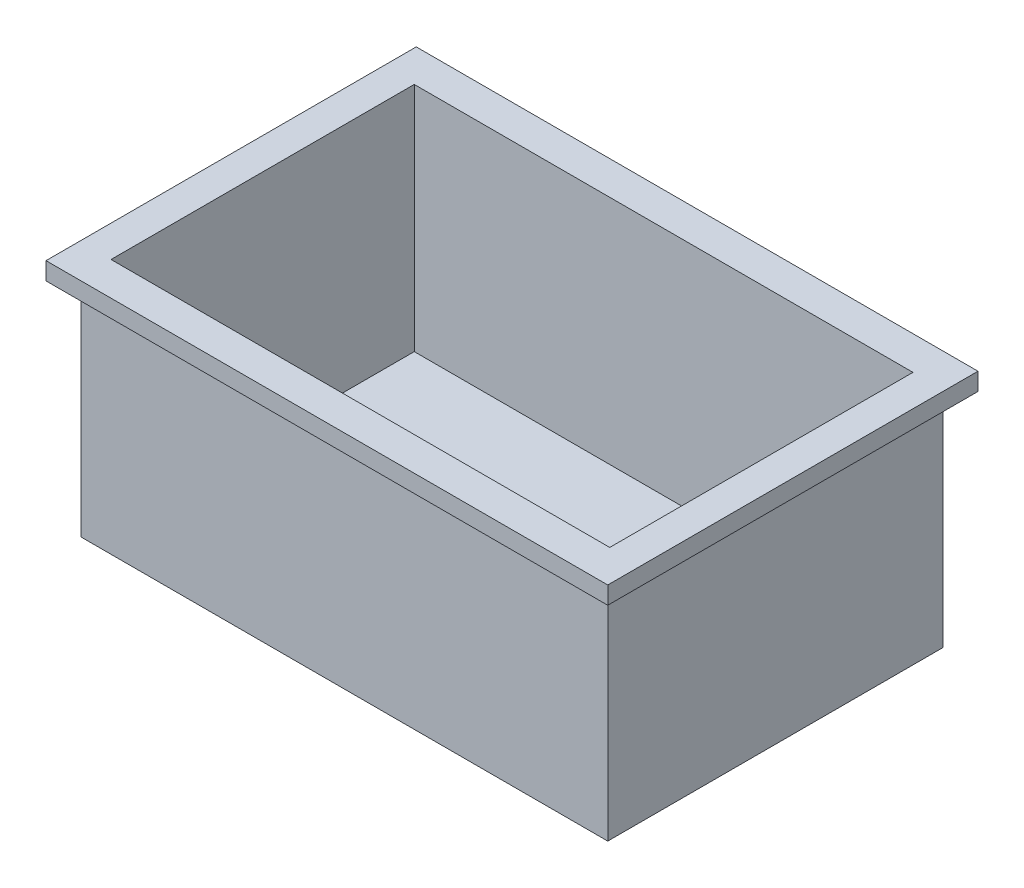
ISO-10303-21;
HEADER;
FILE_DESCRIPTION(('STEP AP214'),'2;1');
FILE_NAME('part.step','',(''),(''),'','','');
FILE_SCHEMA(('AUTOMOTIVE_DESIGN { 1 0 10303 214 1 1 1 1 }'));
ENDSEC;
DATA;
#1=APPLICATION_CONTEXT('core data for automotive mechanical design processes');
#2=APPLICATION_PROTOCOL_DEFINITION('international standard','automotive_design',2000,#1);
#3=PRODUCT_CONTEXT('',#1,'mechanical');
#4=PRODUCT('Part','Part','',(#3));
#5=PRODUCT_RELATED_PRODUCT_CATEGORY('part','',(#4));
#6=PRODUCT_DEFINITION_FORMATION('','',#4);
#7=PRODUCT_DEFINITION_CONTEXT('part definition',#1,'design');
#8=PRODUCT_DEFINITION('design','',#6,#7);
#9=PRODUCT_DEFINITION_SHAPE('','',#8);
#10=(LENGTH_UNIT() NAMED_UNIT(*) SI_UNIT(.MILLI.,.METRE.));
#11=(NAMED_UNIT(*) PLANE_ANGLE_UNIT() SI_UNIT($,.RADIAN.));
#12=(NAMED_UNIT(*) SI_UNIT($,.STERADIAN.) SOLID_ANGLE_UNIT());
#13=UNCERTAINTY_MEASURE_WITH_UNIT(LENGTH_MEASURE(1.E-05),#10,'distance_accuracy_value','');
#14=(GEOMETRIC_REPRESENTATION_CONTEXT(3) GLOBAL_UNCERTAINTY_ASSIGNED_CONTEXT((#13)) GLOBAL_UNIT_ASSIGNED_CONTEXT((#10,
#11,#12)) REPRESENTATION_CONTEXT('',''));
#15=CARTESIAN_POINT('',(0.,0.,0.));
#16=DIRECTION('',(0.,0.,1.));
#17=DIRECTION('',(1.,0.,0.));
#18=AXIS2_PLACEMENT_3D('',#15,#16,#17);
#19=CARTESIAN_POINT('',(312.5,10.,190.));
#20=DIRECTION('',(1.,0.,0.));
#21=DIRECTION('',(0.,0.,-1.));
#22=AXIS2_PLACEMENT_3D('',#19,#20,#21);
#23=PLANE('',#22);
#24=DIRECTION('',(0.,0.,1.));
#25=VECTOR('',#24,1.);
#26=CARTESIAN_POINT('',(312.5,0.,190.));
#27=LINE('',#26,#25);
#28=CARTESIAN_POINT('',(312.5,0.,-190.));
#29=VERTEX_POINT('',#28);
#30=CARTESIAN_POINT('',(312.5,0.,190.));
#31=VERTEX_POINT('',#30);
#32=EDGE_CURVE('E106',#29,#31,#27,.T.);
#33=ORIENTED_EDGE('',*,*,#32,.F.);
#34=DIRECTION('',(0.,-1.,0.));
#35=VECTOR('',#34,1.);
#36=CARTESIAN_POINT('',(312.5,10.,-190.));
#37=LINE('',#36,#35);
#38=CARTESIAN_POINT('',(312.5,10.,-190.));
#39=VERTEX_POINT('',#38);
#40=EDGE_CURVE('E12',#39,#29,#37,.T.);
#41=ORIENTED_EDGE('',*,*,#40,.F.);
#42=DIRECTION('',(0.,0.,1.));
#43=VECTOR('',#42,1.);
#44=CARTESIAN_POINT('',(312.5,10.,190.));
#45=LINE('',#44,#43);
#46=CARTESIAN_POINT('',(312.5,10.,190.));
#47=VERTEX_POINT('',#46);
#48=EDGE_CURVE('E100',#39,#47,#45,.T.);
#49=ORIENTED_EDGE('',*,*,#48,.T.);
#50=DIRECTION('',(0.,-1.,0.));
#51=VECTOR('',#50,1.);
#52=CARTESIAN_POINT('',(312.5,10.,190.));
#53=LINE('',#52,#51);
#54=EDGE_CURVE('E45',#47,#31,#53,.T.);
#55=ORIENTED_EDGE('',*,*,#54,.T.);
#56=EDGE_LOOP('',(#33,#41,#49,#55));
#57=FACE_BOUND('',#56,.T.);
#58=ADVANCED_FACE('F42',(#57),#23,.T.);
#59=CARTESIAN_POINT('',(312.5,10.,-190.));
#60=DIRECTION('',(0.,0.,-1.));
#61=DIRECTION('',(-1.,0.,0.));
#62=AXIS2_PLACEMENT_3D('',#59,#60,#61);
#63=PLANE('',#62);
#64=DIRECTION('',(1.,0.,0.));
#65=VECTOR('',#64,1.);
#66=CARTESIAN_POINT('',(312.5,0.,-190.));
#67=LINE('',#66,#65);
#68=CARTESIAN_POINT('',(-312.5,0.,-190.));
#69=VERTEX_POINT('',#68);
#70=EDGE_CURVE('E102',#69,#29,#67,.T.);
#71=ORIENTED_EDGE('',*,*,#70,.F.);
#72=DIRECTION('',(0.,-1.,0.));
#73=VECTOR('',#72,1.);
#74=CARTESIAN_POINT('',(-312.5,10.,-190.));
#75=LINE('',#74,#73);
#76=CARTESIAN_POINT('',(-312.5,10.,-190.));
#77=VERTEX_POINT('',#76);
#78=EDGE_CURVE('E51',#77,#69,#75,.T.);
#79=ORIENTED_EDGE('',*,*,#78,.F.);
#80=DIRECTION('',(1.,0.,0.));
#81=VECTOR('',#80,1.);
#82=CARTESIAN_POINT('',(312.5,10.,-190.));
#83=LINE('',#82,#81);
#84=EDGE_CURVE('E97',#77,#39,#83,.T.);
#85=ORIENTED_EDGE('',*,*,#84,.T.);
#86=ORIENTED_EDGE('',*,*,#40,.T.);
#87=EDGE_LOOP('',(#71,#79,#85,#86));
#88=FACE_BOUND('',#87,.T.);
#89=ADVANCED_FACE('F116',(#88),#63,.T.);
#90=CARTESIAN_POINT('',(-312.5,10.,190.));
#91=DIRECTION('',(-1.,0.,0.));
#92=DIRECTION('',(0.,0.,1.));
#93=AXIS2_PLACEMENT_3D('',#90,#91,#92);
#94=PLANE('',#93);
#95=DIRECTION('',(0.,0.,-1.));
#96=VECTOR('',#95,1.);
#97=CARTESIAN_POINT('',(-312.5,0.,190.));
#98=LINE('',#97,#96);
#99=CARTESIAN_POINT('',(-312.5,0.,190.));
#100=VERTEX_POINT('',#99);
#101=EDGE_CURVE('E92',#100,#69,#98,.T.);
#102=ORIENTED_EDGE('',*,*,#101,.F.);
#103=DIRECTION('',(0.,-1.,0.));
#104=VECTOR('',#103,1.);
#105=CARTESIAN_POINT('',(-312.5,10.,190.));
#106=LINE('',#105,#104);
#107=CARTESIAN_POINT('',(-312.5,10.,190.));
#108=VERTEX_POINT('',#107);
#109=EDGE_CURVE('E87',#108,#100,#106,.T.);
#110=ORIENTED_EDGE('',*,*,#109,.F.);
#111=DIRECTION('',(0.,0.,-1.));
#112=VECTOR('',#111,1.);
#113=CARTESIAN_POINT('',(-312.5,10.,190.));
#114=LINE('',#113,#112);
#115=EDGE_CURVE('E90',#108,#77,#114,.T.);
#116=ORIENTED_EDGE('',*,*,#115,.T.);
#117=ORIENTED_EDGE('',*,*,#78,.T.);
#118=EDGE_LOOP('',(#102,#110,#116,#117));
#119=FACE_BOUND('',#118,.T.);
#120=ADVANCED_FACE('F89',(#119),#94,.T.);
#121=CARTESIAN_POINT('',(312.5,10.,190.));
#122=DIRECTION('',(0.,0.,1.));
#123=DIRECTION('',(1.,0.,0.));
#124=AXIS2_PLACEMENT_3D('',#121,#122,#123);
#125=PLANE('',#124);
#126=DIRECTION('',(-1.,0.,0.));
#127=VECTOR('',#126,1.);
#128=CARTESIAN_POINT('',(312.5,0.,190.));
#129=LINE('',#128,#127);
#130=EDGE_CURVE('E109',#31,#100,#129,.T.);
#131=ORIENTED_EDGE('',*,*,#130,.F.);
#132=ORIENTED_EDGE('',*,*,#54,.F.);
#133=DIRECTION('',(-1.,0.,0.));
#134=VECTOR('',#133,1.);
#135=CARTESIAN_POINT('',(312.5,10.,190.));
#136=LINE('',#135,#134);
#137=EDGE_CURVE('E96',#47,#108,#136,.T.);
#138=ORIENTED_EDGE('',*,*,#137,.T.);
#139=ORIENTED_EDGE('',*,*,#109,.T.);
#140=EDGE_LOOP('',(#131,#132,#138,#139));
#141=FACE_BOUND('',#140,.T.);
#142=ADVANCED_FACE('F99',(#141),#125,.T.);
#143=CARTESIAN_POINT('',(0.,10.,0.));
#144=DIRECTION('',(0.,1.,0.));
#145=DIRECTION('',(0.,0.,1.));
#146=AXIS2_PLACEMENT_3D('',#143,#144,#145);
#147=PLANE('',#146);
#148=ORIENTED_EDGE('',*,*,#48,.F.);
#149=ORIENTED_EDGE('',*,*,#84,.F.);
#150=ORIENTED_EDGE('',*,*,#115,.F.);
#151=ORIENTED_EDGE('',*,*,#137,.F.);
#152=EDGE_LOOP('',(#148,#149,#150,#151));
#153=FACE_BOUND('',#152,.T.);
#154=ADVANCED_FACE('F95',(#153),#147,.T.);
#155=CARTESIAN_POINT('',(0.,0.,0.));
#156=DIRECTION('',(0.,1.,0.));
#157=DIRECTION('',(0.,0.,1.));
#158=AXIS2_PLACEMENT_3D('',#155,#156,#157);
#159=PLANE('',#158);
#160=ORIENTED_EDGE('',*,*,#32,.T.);
#161=ORIENTED_EDGE('',*,*,#130,.T.);
#162=ORIENTED_EDGE('',*,*,#101,.T.);
#163=ORIENTED_EDGE('',*,*,#70,.T.);
#164=EDGE_LOOP('',(#160,#161,#162,#163));
#165=FACE_BOUND('',#164,.T.);
#166=ADVANCED_FACE('F115',(#165),#159,.F.);
#167=CLOSED_SHELL('',(#58,#89,#120,#142,#154,#166));
#168=MANIFOLD_SOLID_BREP('B2',#167);
#169=CARTESIAN_POINT('',(330.,300.,-210.));
#170=DIRECTION('',(-1.,0.,0.));
#171=DIRECTION('',(0.,0.,1.));
#172=AXIS2_PLACEMENT_3D('',#169,#170,#171);
#173=PLANE('',#172);
#174=DIRECTION('',(0.,0.,-1.));
#175=VECTOR('',#174,1.);
#176=CARTESIAN_POINT('',(330.,278.,210.));
#177=LINE('',#176,#175);
#178=CARTESIAN_POINT('',(330.,278.,210.));
#179=VERTEX_POINT('',#178);
#180=CARTESIAN_POINT('',(330.,278.,-210.));
#181=VERTEX_POINT('',#180);
#182=EDGE_CURVE('E265',#179,#181,#177,.T.);
#183=ORIENTED_EDGE('',*,*,#182,.F.);
#184=DIRECTION('',(0.,-1.,0.));
#185=VECTOR('',#184,1.);
#186=CARTESIAN_POINT('',(330.,300.,210.));
#187=LINE('',#186,#185);
#188=CARTESIAN_POINT('',(330.,0.,210.));
#189=VERTEX_POINT('',#188);
#190=EDGE_CURVE('E252',#179,#189,#187,.T.);
#191=ORIENTED_EDGE('',*,*,#190,.T.);
#192=DIRECTION('',(0.,0.,-1.));
#193=VECTOR('',#192,1.);
#194=CARTESIAN_POINT('',(330.,0.,-210.));
#195=LINE('',#194,#193);
#196=CARTESIAN_POINT('',(330.,0.,-210.));
#197=VERTEX_POINT('',#196);
#198=EDGE_CURVE('E337',#189,#197,#195,.T.);
#199=ORIENTED_EDGE('',*,*,#198,.T.);
#200=DIRECTION('',(0.,-1.,0.));
#201=VECTOR('',#200,1.);
#202=CARTESIAN_POINT('',(330.,300.,-210.));
#203=LINE('',#202,#201);
#204=EDGE_CURVE('E40',#181,#197,#203,.T.);
#205=ORIENTED_EDGE('',*,*,#204,.F.);
#206=EDGE_LOOP('',(#183,#191,#199,#205));
#207=FACE_BOUND('',#206,.T.);
#208=ADVANCED_FACE('F165',(#207),#173,.F.);
#209=CARTESIAN_POINT('',(-330.,300.,-210.));
#210=DIRECTION('',(0.,0.,1.));
#211=DIRECTION('',(1.,0.,0.));
#212=AXIS2_PLACEMENT_3D('',#209,#210,#211);
#213=PLANE('',#212);
#214=DIRECTION('',(-1.,0.,0.));
#215=VECTOR('',#214,1.);
#216=CARTESIAN_POINT('',(330.,278.,-210.));
#217=LINE('',#216,#215);
#218=CARTESIAN_POINT('',(-330.,278.,-210.));
#219=VERTEX_POINT('',#218);
#220=EDGE_CURVE('E178',#181,#219,#217,.T.);
#221=ORIENTED_EDGE('',*,*,#220,.F.);
#222=ORIENTED_EDGE('',*,*,#204,.T.);
#223=DIRECTION('',(-1.,0.,0.));
#224=VECTOR('',#223,1.);
#225=CARTESIAN_POINT('',(-330.,0.,-210.));
#226=LINE('',#225,#224);
#227=CARTESIAN_POINT('',(-330.,0.,-210.));
#228=VERTEX_POINT('',#227);
#229=EDGE_CURVE('E339',#197,#228,#226,.T.);
#230=ORIENTED_EDGE('',*,*,#229,.T.);
#231=DIRECTION('',(0.,-1.,0.));
#232=VECTOR('',#231,1.);
#233=CARTESIAN_POINT('',(-330.,300.,-210.));
#234=LINE('',#233,#232);
#235=EDGE_CURVE('E172',#219,#228,#234,.T.);
#236=ORIENTED_EDGE('',*,*,#235,.F.);
#237=EDGE_LOOP('',(#221,#222,#230,#236));
#238=FACE_BOUND('',#237,.T.);
#239=ADVANCED_FACE('F349',(#238),#213,.F.);
#240=CARTESIAN_POINT('',(-330.,300.,-210.));
#241=DIRECTION('',(1.,0.,0.));
#242=DIRECTION('',(0.,0.,-1.));
#243=AXIS2_PLACEMENT_3D('',#240,#241,#242);
#244=PLANE('',#243);
#245=DIRECTION('',(0.,0.,1.));
#246=VECTOR('',#245,1.);
#247=CARTESIAN_POINT('',(-330.,278.,210.));
#248=LINE('',#247,#246);
#249=CARTESIAN_POINT('',(-330.,278.,210.));
#250=VERTEX_POINT('',#249);
#251=EDGE_CURVE('E186',#219,#250,#248,.T.);
#252=ORIENTED_EDGE('',*,*,#251,.F.);
#253=ORIENTED_EDGE('',*,*,#235,.T.);
#254=DIRECTION('',(0.,0.,1.));
#255=VECTOR('',#254,1.);
#256=CARTESIAN_POINT('',(-330.,0.,-210.));
#257=LINE('',#256,#255);
#258=CARTESIAN_POINT('',(-330.,0.,210.));
#259=VERTEX_POINT('',#258);
#260=EDGE_CURVE('E342',#228,#259,#257,.T.);
#261=ORIENTED_EDGE('',*,*,#260,.T.);
#262=DIRECTION('',(0.,-1.,0.));
#263=VECTOR('',#262,1.);
#264=CARTESIAN_POINT('',(-330.,300.,210.));
#265=LINE('',#264,#263);
#266=EDGE_CURVE('E262',#250,#259,#265,.T.);
#267=ORIENTED_EDGE('',*,*,#266,.F.);
#268=EDGE_LOOP('',(#252,#253,#261,#267));
#269=FACE_BOUND('',#268,.T.);
#270=ADVANCED_FACE('F346',(#269),#244,.F.);
#271=CARTESIAN_POINT('',(-330.,300.,210.));
#272=DIRECTION('',(0.,0.,-1.));
#273=DIRECTION('',(-1.,0.,0.));
#274=AXIS2_PLACEMENT_3D('',#271,#272,#273);
#275=PLANE('',#274);
#276=DIRECTION('',(1.,0.,0.));
#277=VECTOR('',#276,1.);
#278=CARTESIAN_POINT('',(330.,278.,210.));
#279=LINE('',#278,#277);
#280=EDGE_CURVE('E256',#250,#179,#279,.T.);
#281=ORIENTED_EDGE('',*,*,#280,.F.);
#282=ORIENTED_EDGE('',*,*,#266,.T.);
#283=DIRECTION('',(1.,0.,0.));
#284=VECTOR('',#283,1.);
#285=CARTESIAN_POINT('',(-330.,0.,210.));
#286=LINE('',#285,#284);
#287=EDGE_CURVE('E258',#259,#189,#286,.T.);
#288=ORIENTED_EDGE('',*,*,#287,.T.);
#289=ORIENTED_EDGE('',*,*,#190,.F.);
#290=EDGE_LOOP('',(#281,#282,#288,#289));
#291=FACE_BOUND('',#290,.T.);
#292=ADVANCED_FACE('F254',(#291),#275,.F.);
#293=CARTESIAN_POINT('',(0.,300.,0.));
#294=DIRECTION('',(0.,1.,0.));
#295=DIRECTION('',(0.,0.,1.));
#296=AXIS2_PLACEMENT_3D('',#293,#294,#295);
#297=PLANE('',#296);
#298=DIRECTION('',(-1.,0.,0.));
#299=VECTOR('',#298,1.);
#300=CARTESIAN_POINT('',(-312.5,300.,-190.));
#301=LINE('',#300,#299);
#302=CARTESIAN_POINT('',(312.5,300.,-190.));
#303=VERTEX_POINT('',#302);
#304=CARTESIAN_POINT('',(-312.5,300.,-190.));
#305=VERTEX_POINT('',#304);
#306=EDGE_CURVE('E309',#303,#305,#301,.T.);
#307=ORIENTED_EDGE('',*,*,#306,.F.);
#308=DIRECTION('',(0.,0.,-1.));
#309=VECTOR('',#308,1.);
#310=CARTESIAN_POINT('',(312.5,300.,190.));
#311=LINE('',#310,#309);
#312=CARTESIAN_POINT('',(312.5,300.,190.));
#313=VERTEX_POINT('',#312);
#314=EDGE_CURVE('E307',#313,#303,#311,.T.);
#315=ORIENTED_EDGE('',*,*,#314,.F.);
#316=DIRECTION('',(1.,0.,0.));
#317=VECTOR('',#316,1.);
#318=CARTESIAN_POINT('',(-312.5,300.,190.));
#319=LINE('',#318,#317);
#320=CARTESIAN_POINT('',(-312.5,300.,190.));
#321=VERTEX_POINT('',#320);
#322=EDGE_CURVE('E315',#321,#313,#319,.T.);
#323=ORIENTED_EDGE('',*,*,#322,.F.);
#324=DIRECTION('',(0.,0.,1.));
#325=VECTOR('',#324,1.);
#326=CARTESIAN_POINT('',(-312.5,300.,190.));
#327=LINE('',#326,#325);
#328=EDGE_CURVE('E312',#305,#321,#327,.T.);
#329=ORIENTED_EDGE('',*,*,#328,.F.);
#330=EDGE_LOOP('',(#307,#315,#323,#329));
#331=FACE_BOUND('',#330,.T.);
#332=DIRECTION('',(0.,0.,-1.));
#333=VECTOR('',#332,1.);
#334=CARTESIAN_POINT('',(352.,300.,232.));
#335=LINE('',#334,#333);
#336=CARTESIAN_POINT('',(352.,300.,232.));
#337=VERTEX_POINT('',#336);
#338=CARTESIAN_POINT('',(352.,300.,-232.));
#339=VERTEX_POINT('',#338);
#340=EDGE_CURVE('E270',#337,#339,#335,.T.);
#341=ORIENTED_EDGE('',*,*,#340,.T.);
#342=DIRECTION('',(-1.,0.,0.));
#343=VECTOR('',#342,1.);
#344=CARTESIAN_POINT('',(352.,300.,-232.));
#345=LINE('',#344,#343);
#346=CARTESIAN_POINT('',(-352.,300.,-232.));
#347=VERTEX_POINT('',#346);
#348=EDGE_CURVE('E273',#339,#347,#345,.T.);
#349=ORIENTED_EDGE('',*,*,#348,.T.);
#350=DIRECTION('',(0.,0.,1.));
#351=VECTOR('',#350,1.);
#352=CARTESIAN_POINT('',(-352.,300.,232.));
#353=LINE('',#352,#351);
#354=CARTESIAN_POINT('',(-352.,300.,232.));
#355=VERTEX_POINT('',#354);
#356=EDGE_CURVE('E294',#347,#355,#353,.T.);
#357=ORIENTED_EDGE('',*,*,#356,.T.);
#358=DIRECTION('',(1.,0.,0.));
#359=VECTOR('',#358,1.);
#360=CARTESIAN_POINT('',(352.,300.,232.));
#361=LINE('',#360,#359);
#362=EDGE_CURVE('E282',#355,#337,#361,.T.);
#363=ORIENTED_EDGE('',*,*,#362,.T.);
#364=EDGE_LOOP('',(#341,#349,#357,#363));
#365=FACE_BOUND('',#364,.T.);
#366=ADVANCED_FACE('F355',(#331,#365),#297,.T.);
#367=CARTESIAN_POINT('',(0.,0.,0.));
#368=DIRECTION('',(0.,1.,0.));
#369=DIRECTION('',(0.,0.,1.));
#370=AXIS2_PLACEMENT_3D('',#367,#368,#369);
#371=PLANE('',#370);
#372=ORIENTED_EDGE('',*,*,#198,.F.);
#373=ORIENTED_EDGE('',*,*,#287,.F.);
#374=ORIENTED_EDGE('',*,*,#260,.F.);
#375=ORIENTED_EDGE('',*,*,#229,.F.);
#376=EDGE_LOOP('',(#372,#373,#374,#375));
#377=FACE_BOUND('',#376,.T.);
#378=DIRECTION('',(0.,0.,-1.));
#379=VECTOR('',#378,1.);
#380=CARTESIAN_POINT('',(312.5,0.,190.));
#381=LINE('',#380,#379);
#382=CARTESIAN_POINT('',(312.5,0.,190.));
#383=VERTEX_POINT('',#382);
#384=CARTESIAN_POINT('',(312.5,0.,-190.));
#385=VERTEX_POINT('',#384);
#386=EDGE_CURVE('E301',#383,#385,#381,.T.);
#387=ORIENTED_EDGE('',*,*,#386,.T.);
#388=DIRECTION('',(-1.,0.,0.));
#389=VECTOR('',#388,1.);
#390=CARTESIAN_POINT('',(-312.5,0.,-190.));
#391=LINE('',#390,#389);
#392=CARTESIAN_POINT('',(-312.5,0.,-190.));
#393=VERTEX_POINT('',#392);
#394=EDGE_CURVE('E320',#385,#393,#391,.T.);
#395=ORIENTED_EDGE('',*,*,#394,.T.);
#396=DIRECTION('',(0.,0.,1.));
#397=VECTOR('',#396,1.);
#398=CARTESIAN_POINT('',(-312.5,0.,190.));
#399=LINE('',#398,#397);
#400=CARTESIAN_POINT('',(-312.5,0.,190.));
#401=VERTEX_POINT('',#400);
#402=EDGE_CURVE('E323',#393,#401,#399,.T.);
#403=ORIENTED_EDGE('',*,*,#402,.T.);
#404=DIRECTION('',(1.,0.,0.));
#405=VECTOR('',#404,1.);
#406=CARTESIAN_POINT('',(-312.5,0.,190.));
#407=LINE('',#406,#405);
#408=EDGE_CURVE('E310',#401,#383,#407,.T.);
#409=ORIENTED_EDGE('',*,*,#408,.T.);
#410=EDGE_LOOP('',(#387,#395,#403,#409));
#411=FACE_BOUND('',#410,.T.);
#412=ADVANCED_FACE('F351',(#377,#411),#371,.F.);
#413=CARTESIAN_POINT('',(312.5,300.,190.));
#414=DIRECTION('',(-1.,0.,0.));
#415=DIRECTION('',(0.,0.,1.));
#416=AXIS2_PLACEMENT_3D('',#413,#414,#415);
#417=PLANE('',#416);
#418=ORIENTED_EDGE('',*,*,#386,.F.);
#419=DIRECTION('',(0.,-1.,0.));
#420=VECTOR('',#419,1.);
#421=CARTESIAN_POINT('',(312.5,300.,190.));
#422=LINE('',#421,#420);
#423=EDGE_CURVE('E317',#313,#383,#422,.T.);
#424=ORIENTED_EDGE('',*,*,#423,.F.);
#425=ORIENTED_EDGE('',*,*,#314,.T.);
#426=DIRECTION('',(0.,-1.,0.));
#427=VECTOR('',#426,1.);
#428=CARTESIAN_POINT('',(312.5,300.,-190.));
#429=LINE('',#428,#427);
#430=EDGE_CURVE('E334',#303,#385,#429,.T.);
#431=ORIENTED_EDGE('',*,*,#430,.T.);
#432=EDGE_LOOP('',(#418,#424,#425,#431));
#433=FACE_BOUND('',#432,.T.);
#434=ADVANCED_FACE('F354',(#433),#417,.T.);
#435=CARTESIAN_POINT('',(-312.5,300.,-190.));
#436=DIRECTION('',(0.,0.,1.));
#437=DIRECTION('',(1.,0.,0.));
#438=AXIS2_PLACEMENT_3D('',#435,#436,#437);
#439=PLANE('',#438);
#440=ORIENTED_EDGE('',*,*,#394,.F.);
#441=ORIENTED_EDGE('',*,*,#430,.F.);
#442=ORIENTED_EDGE('',*,*,#306,.T.);
#443=DIRECTION('',(0.,-1.,0.));
#444=VECTOR('',#443,1.);
#445=CARTESIAN_POINT('',(-312.5,300.,-190.));
#446=LINE('',#445,#444);
#447=EDGE_CURVE('E332',#305,#393,#446,.T.);
#448=ORIENTED_EDGE('',*,*,#447,.T.);
#449=EDGE_LOOP('',(#440,#441,#442,#448));
#450=FACE_BOUND('',#449,.T.);
#451=ADVANCED_FACE('F370',(#450),#439,.T.);
#452=CARTESIAN_POINT('',(-312.5,300.,190.));
#453=DIRECTION('',(1.,0.,0.));
#454=DIRECTION('',(0.,0.,-1.));
#455=AXIS2_PLACEMENT_3D('',#452,#453,#454);
#456=PLANE('',#455);
#457=ORIENTED_EDGE('',*,*,#402,.F.);
#458=ORIENTED_EDGE('',*,*,#447,.F.);
#459=ORIENTED_EDGE('',*,*,#328,.T.);
#460=DIRECTION('',(0.,-1.,0.));
#461=VECTOR('',#460,1.);
#462=CARTESIAN_POINT('',(-312.5,300.,190.));
#463=LINE('',#462,#461);
#464=EDGE_CURVE('E330',#321,#401,#463,.T.);
#465=ORIENTED_EDGE('',*,*,#464,.T.);
#466=EDGE_LOOP('',(#457,#458,#459,#465));
#467=FACE_BOUND('',#466,.T.);
#468=ADVANCED_FACE('F374',(#467),#456,.T.);
#469=CARTESIAN_POINT('',(-312.5,300.,190.));
#470=DIRECTION('',(0.,0.,-1.));
#471=DIRECTION('',(-1.,0.,0.));
#472=AXIS2_PLACEMENT_3D('',#469,#470,#471);
#473=PLANE('',#472);
#474=ORIENTED_EDGE('',*,*,#408,.F.);
#475=ORIENTED_EDGE('',*,*,#464,.F.);
#476=ORIENTED_EDGE('',*,*,#322,.T.);
#477=ORIENTED_EDGE('',*,*,#423,.T.);
#478=EDGE_LOOP('',(#474,#475,#476,#477));
#479=FACE_BOUND('',#478,.T.);
#480=ADVANCED_FACE('F363',(#479),#473,.T.);
#481=CARTESIAN_POINT('',(352.,278.,232.));
#482=DIRECTION('',(1.,0.,0.));
#483=DIRECTION('',(0.,0.,-1.));
#484=AXIS2_PLACEMENT_3D('',#481,#482,#483);
#485=PLANE('',#484);
#486=ORIENTED_EDGE('',*,*,#340,.F.);
#487=DIRECTION('',(0.,1.,0.));
#488=VECTOR('',#487,1.);
#489=CARTESIAN_POINT('',(352.,278.,232.));
#490=LINE('',#489,#488);
#491=CARTESIAN_POINT('',(352.,278.,232.));
#492=VERTEX_POINT('',#491);
#493=EDGE_CURVE('E299',#492,#337,#490,.T.);
#494=ORIENTED_EDGE('',*,*,#493,.F.);
#495=DIRECTION('',(0.,0.,-1.));
#496=VECTOR('',#495,1.);
#497=CARTESIAN_POINT('',(352.,278.,232.));
#498=LINE('',#497,#496);
#499=CARTESIAN_POINT('',(352.,278.,-232.));
#500=VERTEX_POINT('',#499);
#501=EDGE_CURVE('E278',#492,#500,#498,.T.);
#502=ORIENTED_EDGE('',*,*,#501,.T.);
#503=DIRECTION('',(0.,1.,0.));
#504=VECTOR('',#503,1.);
#505=CARTESIAN_POINT('',(352.,278.,-232.));
#506=LINE('',#505,#504);
#507=EDGE_CURVE('E290',#500,#339,#506,.T.);
#508=ORIENTED_EDGE('',*,*,#507,.T.);
#509=EDGE_LOOP('',(#486,#494,#502,#508));
#510=FACE_BOUND('',#509,.T.);
#511=ADVANCED_FACE('F381',(#510),#485,.T.);
#512=CARTESIAN_POINT('',(352.,278.,232.));
#513=DIRECTION('',(0.,0.,1.));
#514=DIRECTION('',(1.,0.,0.));
#515=AXIS2_PLACEMENT_3D('',#512,#513,#514);
#516=PLANE('',#515);
#517=ORIENTED_EDGE('',*,*,#362,.F.);
#518=DIRECTION('',(0.,1.,0.));
#519=VECTOR('',#518,1.);
#520=CARTESIAN_POINT('',(-352.,278.,232.));
#521=LINE('',#520,#519);
#522=CARTESIAN_POINT('',(-352.,278.,232.));
#523=VERTEX_POINT('',#522);
#524=EDGE_CURVE('E302',#523,#355,#521,.T.);
#525=ORIENTED_EDGE('',*,*,#524,.F.);
#526=DIRECTION('',(1.,0.,0.));
#527=VECTOR('',#526,1.);
#528=CARTESIAN_POINT('',(352.,278.,232.));
#529=LINE('',#528,#527);
#530=EDGE_CURVE('E288',#523,#492,#529,.T.);
#531=ORIENTED_EDGE('',*,*,#530,.T.);
#532=ORIENTED_EDGE('',*,*,#493,.T.);
#533=EDGE_LOOP('',(#517,#525,#531,#532));
#534=FACE_BOUND('',#533,.T.);
#535=ADVANCED_FACE('F452',(#534),#516,.T.);
#536=CARTESIAN_POINT('',(-352.,278.,232.));
#537=DIRECTION('',(-1.,0.,0.));
#538=DIRECTION('',(0.,0.,1.));
#539=AXIS2_PLACEMENT_3D('',#536,#537,#538);
#540=PLANE('',#539);
#541=ORIENTED_EDGE('',*,*,#356,.F.);
#542=DIRECTION('',(0.,1.,0.));
#543=VECTOR('',#542,1.);
#544=CARTESIAN_POINT('',(-352.,278.,-232.));
#545=LINE('',#544,#543);
#546=CARTESIAN_POINT('',(-352.,278.,-232.));
#547=VERTEX_POINT('',#546);
#548=EDGE_CURVE('E304',#547,#347,#545,.T.);
#549=ORIENTED_EDGE('',*,*,#548,.F.);
#550=DIRECTION('',(0.,0.,1.));
#551=VECTOR('',#550,1.);
#552=CARTESIAN_POINT('',(-352.,278.,232.));
#553=LINE('',#552,#551);
#554=EDGE_CURVE('E285',#547,#523,#553,.T.);
#555=ORIENTED_EDGE('',*,*,#554,.T.);
#556=ORIENTED_EDGE('',*,*,#524,.T.);
#557=EDGE_LOOP('',(#541,#549,#555,#556));
#558=FACE_BOUND('',#557,.T.);
#559=ADVANCED_FACE('F462',(#558),#540,.T.);
#560=CARTESIAN_POINT('',(352.,278.,-232.));
#561=DIRECTION('',(0.,0.,-1.));
#562=DIRECTION('',(-1.,0.,0.));
#563=AXIS2_PLACEMENT_3D('',#560,#561,#562);
#564=PLANE('',#563);
#565=ORIENTED_EDGE('',*,*,#348,.F.);
#566=ORIENTED_EDGE('',*,*,#507,.F.);
#567=DIRECTION('',(-1.,0.,0.));
#568=VECTOR('',#567,1.);
#569=CARTESIAN_POINT('',(352.,278.,-232.));
#570=LINE('',#569,#568);
#571=EDGE_CURVE('E281',#500,#547,#570,.T.);
#572=ORIENTED_EDGE('',*,*,#571,.T.);
#573=ORIENTED_EDGE('',*,*,#548,.T.);
#574=EDGE_LOOP('',(#565,#566,#572,#573));
#575=FACE_BOUND('',#574,.T.);
#576=ADVANCED_FACE('F472',(#575),#564,.T.);
#577=CARTESIAN_POINT('',(0.,278.,0.));
#578=DIRECTION('',(0.,1.,0.));
#579=DIRECTION('',(0.,0.,1.));
#580=AXIS2_PLACEMENT_3D('',#577,#578,#579);
#581=PLANE('',#580);
#582=ORIENTED_EDGE('',*,*,#280,.T.);
#583=ORIENTED_EDGE('',*,*,#182,.T.);
#584=ORIENTED_EDGE('',*,*,#220,.T.);
#585=ORIENTED_EDGE('',*,*,#251,.T.);
#586=EDGE_LOOP('',(#582,#583,#584,#585));
#587=FACE_BOUND('',#586,.T.);
#588=ORIENTED_EDGE('',*,*,#501,.F.);
#589=ORIENTED_EDGE('',*,*,#530,.F.);
#590=ORIENTED_EDGE('',*,*,#554,.F.);
#591=ORIENTED_EDGE('',*,*,#571,.F.);
#592=EDGE_LOOP('',(#588,#589,#590,#591));
#593=FACE_BOUND('',#592,.T.);
#594=ADVANCED_FACE('F268',(#587,#593),#581,.F.);
#595=CLOSED_SHELL('',(#208,#239,#270,#292,#366,#412,#434,#451,#468,#480,#511,#535,#559,#576,#594));
#596=MANIFOLD_SOLID_BREP('B6',#595);
#597=ADVANCED_BREP_SHAPE_REPRESENTATION('',(#18,#168,#596),#14);
#598=SHAPE_DEFINITION_REPRESENTATION(#9,#597);
ENDSEC;
END-ISO-10303-21;
